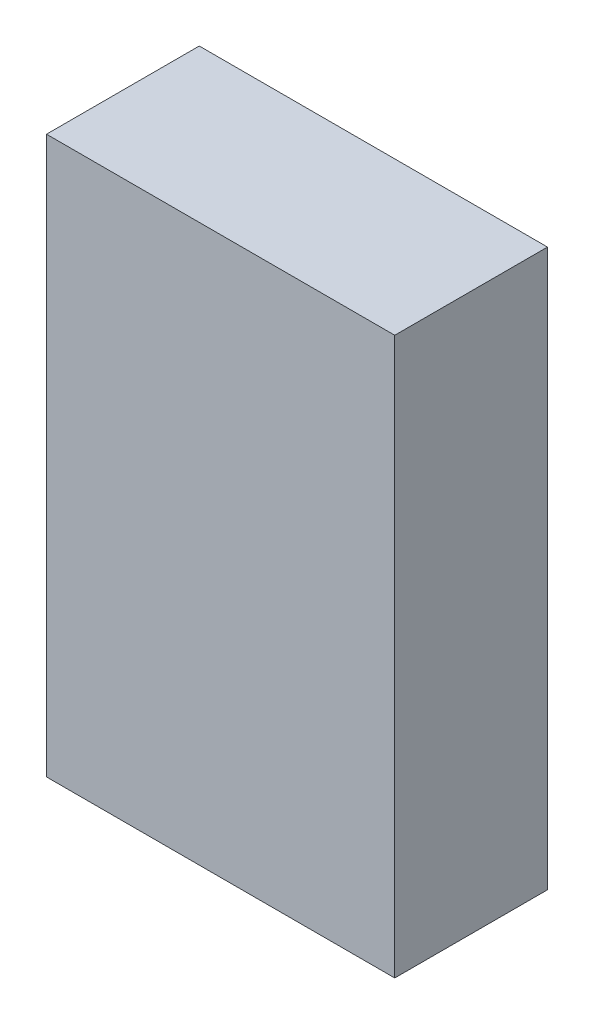
ISO-10303-21;
HEADER;
FILE_DESCRIPTION(('STEP AP214'),'2;1');
FILE_NAME('part.step','',(''),(''),'','','');
FILE_SCHEMA(('AUTOMOTIVE_DESIGN { 1 0 10303 214 1 1 1 1 }'));
ENDSEC;
DATA;
#1=APPLICATION_CONTEXT('core data for automotive mechanical design processes');
#2=APPLICATION_PROTOCOL_DEFINITION('international standard','automotive_design',2000,#1);
#3=PRODUCT_CONTEXT('',#1,'mechanical');
#4=PRODUCT('Part','Part','',(#3));
#5=PRODUCT_RELATED_PRODUCT_CATEGORY('part','',(#4));
#6=PRODUCT_DEFINITION_FORMATION('','',#4);
#7=PRODUCT_DEFINITION_CONTEXT('part definition',#1,'design');
#8=PRODUCT_DEFINITION('design','',#6,#7);
#9=PRODUCT_DEFINITION_SHAPE('','',#8);
#10=(LENGTH_UNIT() NAMED_UNIT(*) SI_UNIT(.MILLI.,.METRE.));
#11=(NAMED_UNIT(*) PLANE_ANGLE_UNIT() SI_UNIT($,.RADIAN.));
#12=(NAMED_UNIT(*) SI_UNIT($,.STERADIAN.) SOLID_ANGLE_UNIT());
#13=UNCERTAINTY_MEASURE_WITH_UNIT(LENGTH_MEASURE(1.E-05),#10,'distance_accuracy_value','');
#14=(GEOMETRIC_REPRESENTATION_CONTEXT(3) GLOBAL_UNCERTAINTY_ASSIGNED_CONTEXT((#13)) GLOBAL_UNIT_ASSIGNED_CONTEXT((#10,
#11,#12)) REPRESENTATION_CONTEXT('',''));
#15=CARTESIAN_POINT('',(0.,0.,0.));
#16=DIRECTION('',(0.,0.,1.));
#17=DIRECTION('',(1.,0.,0.));
#18=AXIS2_PLACEMENT_3D('',#15,#16,#17);
#19=CARTESIAN_POINT('',(0.,0.,2.));
#20=DIRECTION('',(0.,0.,-1.));
#21=DIRECTION('',(-1.,0.,0.));
#22=AXIS2_PLACEMENT_3D('',#19,#20,#21);
#23=PLANE('',#22);
#24=DIRECTION('',(1.,0.,0.));
#25=VECTOR('',#24,1.);
#26=CARTESIAN_POINT('',(-25.2899999999998,-22.38,2.));
#27=LINE('',#26,#25);
#28=CARTESIAN_POINT('',(-25.2899999999998,-22.38,2.));
#29=VERTEX_POINT('',#28);
#30=CARTESIAN_POINT('',(66.129932689862,-22.38,2.));
#31=VERTEX_POINT('',#30);
#32=EDGE_CURVE('E249',#29,#31,#27,.T.);
#33=ORIENTED_EDGE('',*,*,#32,.T.);
#34=DIRECTION('',(0.,1.,0.));
#35=VECTOR('',#34,1.);
#36=CARTESIAN_POINT('',(66.129932689862,-22.38,2.));
#37=LINE('',#36,#35);
#38=CARTESIAN_POINT('',(66.129932689862,123.75,2.));
#39=VERTEX_POINT('',#38);
#40=EDGE_CURVE('E246',#31,#39,#37,.T.);
#41=ORIENTED_EDGE('',*,*,#40,.T.);
#42=DIRECTION('',(-1.,0.,0.));
#43=VECTOR('',#42,1.);
#44=CARTESIAN_POINT('',(66.129932689862,123.75,2.));
#45=LINE('',#44,#43);
#46=CARTESIAN_POINT('',(-25.2899999999998,123.75,2.));
#47=VERTEX_POINT('',#46);
#48=EDGE_CURVE('E243',#39,#47,#45,.T.);
#49=ORIENTED_EDGE('',*,*,#48,.T.);
#50=DIRECTION('',(0.,-1.,0.));
#51=VECTOR('',#50,1.);
#52=CARTESIAN_POINT('',(-25.2899999999998,123.75,2.));
#53=LINE('',#52,#51);
#54=EDGE_CURVE('E239',#47,#29,#53,.T.);
#55=ORIENTED_EDGE('',*,*,#54,.T.);
#56=EDGE_LOOP('',(#33,#41,#49,#55));
#57=FACE_BOUND('',#56,.T.);
#58=ADVANCED_FACE('F35',(#57),#23,.F.);
#59=CARTESIAN_POINT('',(-25.2899999999998,-22.38,-210.470475989999));
#60=DIRECTION('',(0.,-1.,0.));
#61=DIRECTION('',(0.,0.,-1.));
#62=AXIS2_PLACEMENT_3D('',#59,#60,#61);
#63=PLANE('',#62);
#64=CARTESIAN_POINT('',(32.78,-22.38,-19.755));
#65=DIRECTION('',(0.,-1.,0.));
#66=DIRECTION('',(0.,0.,-1.));
#67=AXIS2_PLACEMENT_3D('',#64,#65,#66);
#68=CIRCLE('',#67,2.5);
#69=CARTESIAN_POINT('',(31.8966666666667,-22.38,-22.0937437273507));
#70=VERTEX_POINT('',#69);
#71=CARTESIAN_POINT('',(31.8966666666667,-22.38,-17.4162562726493));
#72=VERTEX_POINT('',#71);
#73=EDGE_CURVE('E50',#70,#72,#68,.T.);
#74=ORIENTED_EDGE('',*,*,#73,.F.);
#75=CARTESIAN_POINT('',(26.48,-22.38,-19.755));
#76=DIRECTION('',(0.,-1.,0.));
#77=DIRECTION('',(0.,0.,-1.));
#78=AXIS2_PLACEMENT_3D('',#75,#76,#77);
#79=CIRCLE('',#78,5.9);
#80=EDGE_CURVE('E167',#72,#70,#79,.T.);
#81=ORIENTED_EDGE('',*,*,#80,.F.);
#82=EDGE_LOOP('',(#74,#81));
#83=FACE_BOUND('',#82,.T.);
#84=DIRECTION('',(0.,0.,-1.));
#85=VECTOR('',#84,1.);
#86=CARTESIAN_POINT('',(-15.95,-22.38,0.));
#87=LINE('',#86,#85);
#88=CARTESIAN_POINT('',(-15.95,-22.38,0.));
#89=VERTEX_POINT('',#88);
#90=CARTESIAN_POINT('',(-15.95,-22.38,-4.));
#91=VERTEX_POINT('',#90);
#92=EDGE_CURVE('E58',#89,#91,#87,.T.);
#93=ORIENTED_EDGE('',*,*,#92,.F.);
#94=DIRECTION('',(-1.,0.,0.));
#95=VECTOR('',#94,1.);
#96=CARTESIAN_POINT('',(1.95,-22.38,0.));
#97=LINE('',#96,#95);
#98=CARTESIAN_POINT('',(1.95,-22.38,0.));
#99=VERTEX_POINT('',#98);
#100=EDGE_CURVE('E199',#99,#89,#97,.T.);
#101=ORIENTED_EDGE('',*,*,#100,.F.);
#102=DIRECTION('',(0.,0.,1.));
#103=VECTOR('',#102,1.);
#104=CARTESIAN_POINT('',(1.95,-22.38,-4.));
#105=LINE('',#104,#103);
#106=CARTESIAN_POINT('',(1.95,-22.38,-4.));
#107=VERTEX_POINT('',#106);
#108=EDGE_CURVE('E196',#107,#99,#105,.T.);
#109=ORIENTED_EDGE('',*,*,#108,.F.);
#110=DIRECTION('',(1.,0.,0.));
#111=VECTOR('',#110,1.);
#112=CARTESIAN_POINT('',(-15.95,-22.38,-4.));
#113=LINE('',#112,#111);
#114=EDGE_CURVE('E193',#91,#107,#113,.T.);
#115=ORIENTED_EDGE('',*,*,#114,.F.);
#116=EDGE_LOOP('',(#93,#101,#109,#115));
#117=FACE_BOUND('',#116,.T.);
#118=DIRECTION('',(0.,0.,1.));
#119=VECTOR('',#118,1.);
#120=CARTESIAN_POINT('',(13.73,-22.38,-23.91));
#121=LINE('',#120,#119);
#122=CARTESIAN_POINT('',(13.73,-22.38,-23.91));
#123=VERTEX_POINT('',#122);
#124=CARTESIAN_POINT('',(13.73,-22.38,-15.6));
#125=VERTEX_POINT('',#124);
#126=EDGE_CURVE('E217',#123,#125,#121,.T.);
#127=ORIENTED_EDGE('',*,*,#126,.F.);
#128=DIRECTION('',(1.,0.,0.));
#129=VECTOR('',#128,1.);
#130=CARTESIAN_POINT('',(-13.73,-22.38,-23.91));
#131=LINE('',#130,#129);
#132=CARTESIAN_POINT('',(-13.73,-22.38,-23.91));
#133=VERTEX_POINT('',#132);
#134=EDGE_CURVE('E225',#133,#123,#131,.T.);
#135=ORIENTED_EDGE('',*,*,#134,.F.);
#136=DIRECTION('',(0.,0.,-1.));
#137=VECTOR('',#136,1.);
#138=CARTESIAN_POINT('',(-13.73,-22.38,-15.6));
#139=LINE('',#138,#137);
#140=CARTESIAN_POINT('',(-13.73,-22.38,-15.6));
#141=VERTEX_POINT('',#140);
#142=EDGE_CURVE('E222',#141,#133,#139,.T.);
#143=ORIENTED_EDGE('',*,*,#142,.F.);
#144=DIRECTION('',(-1.,0.,0.));
#145=VECTOR('',#144,1.);
#146=CARTESIAN_POINT('',(13.73,-22.38,-15.6));
#147=LINE('',#146,#145);
#148=EDGE_CURVE('E219',#125,#141,#147,.T.);
#149=ORIENTED_EDGE('',*,*,#148,.F.);
#150=EDGE_LOOP('',(#127,#135,#143,#149));
#151=FACE_BOUND('',#150,.T.);
#152=DIRECTION('',(0.,0.,1.));
#153=VECTOR('',#152,1.);
#154=CARTESIAN_POINT('',(-25.2899999999998,-22.38,-210.470475989999));
#155=LINE('',#154,#153);
#156=CARTESIAN_POINT('',(-25.2899999999998,-22.38,-38.1));
#157=VERTEX_POINT('',#156);
#158=EDGE_CURVE('E274',#157,#29,#155,.T.);
#159=ORIENTED_EDGE('',*,*,#158,.F.);
#160=DIRECTION('',(1.,0.,0.));
#161=VECTOR('',#160,1.);
#162=CARTESIAN_POINT('',(-25.2899999999998,-22.38,-38.1));
#163=LINE('',#162,#161);
#164=CARTESIAN_POINT('',(66.129932689862,-22.38,-38.1));
#165=VERTEX_POINT('',#164);
#166=EDGE_CURVE('E173',#157,#165,#163,.T.);
#167=ORIENTED_EDGE('',*,*,#166,.T.);
#168=DIRECTION('',(0.,0.,1.));
#169=VECTOR('',#168,1.);
#170=CARTESIAN_POINT('',(66.129932689862,-22.38,-210.470475989999));
#171=LINE('',#170,#169);
#172=EDGE_CURVE('E270',#165,#31,#171,.T.);
#173=ORIENTED_EDGE('',*,*,#172,.T.);
#174=ORIENTED_EDGE('',*,*,#32,.F.);
#175=EDGE_LOOP('',(#159,#167,#173,#174));
#176=FACE_BOUND('',#175,.T.);
#177=ADVANCED_FACE('F328',(#83,#117,#151,#176),#63,.T.);
#178=CARTESIAN_POINT('',(-25.2899999999998,123.75,-210.470475989999));
#179=DIRECTION('',(-1.,0.,0.));
#180=DIRECTION('',(0.,0.,1.));
#181=AXIS2_PLACEMENT_3D('',#178,#179,#180);
#182=PLANE('',#181);
#183=DIRECTION('',(0.,0.,1.));
#184=VECTOR('',#183,1.);
#185=CARTESIAN_POINT('',(-25.2899999999998,123.75,-210.470475989999));
#186=LINE('',#185,#184);
#187=CARTESIAN_POINT('',(-25.2899999999998,123.75,-38.1));
#188=VERTEX_POINT('',#187);
#189=EDGE_CURVE('E257',#188,#47,#186,.T.);
#190=ORIENTED_EDGE('',*,*,#189,.F.);
#191=DIRECTION('',(0.,-1.,0.));
#192=VECTOR('',#191,1.);
#193=CARTESIAN_POINT('',(-25.2899999999998,123.75,-38.1));
#194=LINE('',#193,#192);
#195=EDGE_CURVE('E271',#188,#157,#194,.T.);
#196=ORIENTED_EDGE('',*,*,#195,.T.);
#197=ORIENTED_EDGE('',*,*,#158,.T.);
#198=ORIENTED_EDGE('',*,*,#54,.F.);
#199=EDGE_LOOP('',(#190,#196,#197,#198));
#200=FACE_BOUND('',#199,.T.);
#201=ADVANCED_FACE('F333',(#200),#182,.T.);
#202=CARTESIAN_POINT('',(66.129932689862,123.75,-210.470475989999));
#203=DIRECTION('',(0.,1.,0.));
#204=DIRECTION('',(0.,0.,1.));
#205=AXIS2_PLACEMENT_3D('',#202,#203,#204);
#206=PLANE('',#205);
#207=DIRECTION('',(0.,0.,1.));
#208=VECTOR('',#207,1.);
#209=CARTESIAN_POINT('',(66.129932689862,123.75,-210.470475989999));
#210=LINE('',#209,#208);
#211=CARTESIAN_POINT('',(66.129932689862,123.75,-38.1000000000001));
#212=VERTEX_POINT('',#211);
#213=EDGE_CURVE('E256',#212,#39,#210,.T.);
#214=ORIENTED_EDGE('',*,*,#213,.F.);
#215=DIRECTION('',(-1.,0.,0.));
#216=VECTOR('',#215,1.);
#217=CARTESIAN_POINT('',(66.129932689862,123.75,-38.1));
#218=LINE('',#217,#216);
#219=EDGE_CURVE('E275',#212,#188,#218,.T.);
#220=ORIENTED_EDGE('',*,*,#219,.T.);
#221=ORIENTED_EDGE('',*,*,#189,.T.);
#222=ORIENTED_EDGE('',*,*,#48,.F.);
#223=EDGE_LOOP('',(#214,#220,#221,#222));
#224=FACE_BOUND('',#223,.T.);
#225=ADVANCED_FACE('F345',(#224),#206,.T.);
#226=CARTESIAN_POINT('',(66.129932689862,-22.38,-210.470475989999));
#227=DIRECTION('',(1.,0.,0.));
#228=DIRECTION('',(0.,0.,-1.));
#229=AXIS2_PLACEMENT_3D('',#226,#227,#228);
#230=PLANE('',#229);
#231=ORIENTED_EDGE('',*,*,#172,.F.);
#232=DIRECTION('',(0.,1.,0.));
#233=VECTOR('',#232,1.);
#234=CARTESIAN_POINT('',(66.129932689862,-22.38,-38.1));
#235=LINE('',#234,#233);
#236=EDGE_CURVE('E253',#165,#212,#235,.T.);
#237=ORIENTED_EDGE('',*,*,#236,.T.);
#238=ORIENTED_EDGE('',*,*,#213,.T.);
#239=ORIENTED_EDGE('',*,*,#40,.F.);
#240=EDGE_LOOP('',(#231,#237,#238,#239));
#241=FACE_BOUND('',#240,.T.);
#242=ADVANCED_FACE('F341',(#241),#230,.T.);
#243=CARTESIAN_POINT('',(-23.2899999999998,-20.38,-210.470475989999));
#244=DIRECTION('',(0.,-1.,0.));
#245=DIRECTION('',(1.,0.,0.));
#246=AXIS2_PLACEMENT_3D('',#243,#244,#245);
#247=PLANE('',#246);
#248=CARTESIAN_POINT('',(26.48,-20.38,-19.755));
#249=DIRECTION('',(0.,-1.,0.));
#250=DIRECTION('',(1.,0.,0.));
#251=AXIS2_PLACEMENT_3D('',#248,#249,#250);
#252=CIRCLE('',#251,5.9);
#253=CARTESIAN_POINT('',(31.8966666666667,-20.38,-22.0937437273507));
#254=VERTEX_POINT('',#253);
#255=CARTESIAN_POINT('',(31.8966666666667,-20.38,-17.4162562726493));
#256=VERTEX_POINT('',#255);
#257=EDGE_CURVE('E170',#254,#256,#252,.F.);
#258=ORIENTED_EDGE('',*,*,#257,.F.);
#259=CARTESIAN_POINT('',(32.78,-20.38,-19.755));
#260=DIRECTION('',(0.,-1.,0.));
#261=DIRECTION('',(1.,0.,0.));
#262=AXIS2_PLACEMENT_3D('',#259,#260,#261);
#263=CIRCLE('',#262,2.5);
#264=EDGE_CURVE('E161',#256,#254,#263,.F.);
#265=ORIENTED_EDGE('',*,*,#264,.F.);
#266=EDGE_LOOP('',(#258,#265));
#267=FACE_BOUND('',#266,.T.);
#268=DIRECTION('',(1.,0.,0.));
#269=VECTOR('',#268,1.);
#270=CARTESIAN_POINT('',(64.129932689862,-20.38,0.));
#271=LINE('',#270,#269);
#272=CARTESIAN_POINT('',(-23.2899999999998,-20.38,0.));
#273=VERTEX_POINT('',#272);
#274=CARTESIAN_POINT('',(-15.95,-20.38,0.));
#275=VERTEX_POINT('',#274);
#276=EDGE_CURVE('E11',#273,#275,#271,.T.);
#277=ORIENTED_EDGE('',*,*,#276,.T.);
#278=DIRECTION('',(0.,0.,1.));
#279=VECTOR('',#278,1.);
#280=CARTESIAN_POINT('',(-15.95,-20.38,0.));
#281=LINE('',#280,#279);
#282=CARTESIAN_POINT('',(-15.95,-20.38,-4.));
#283=VERTEX_POINT('',#282);
#284=EDGE_CURVE('E189',#283,#275,#281,.T.);
#285=ORIENTED_EDGE('',*,*,#284,.F.);
#286=DIRECTION('',(-1.,0.,0.));
#287=VECTOR('',#286,1.);
#288=CARTESIAN_POINT('',(-15.95,-20.38,-4.));
#289=LINE('',#288,#287);
#290=CARTESIAN_POINT('',(1.95,-20.38,-4.));
#291=VERTEX_POINT('',#290);
#292=EDGE_CURVE('E177',#291,#283,#289,.T.);
#293=ORIENTED_EDGE('',*,*,#292,.F.);
#294=DIRECTION('',(0.,0.,-1.));
#295=VECTOR('',#294,1.);
#296=CARTESIAN_POINT('',(1.95,-20.38,-4.));
#297=LINE('',#296,#295);
#298=CARTESIAN_POINT('',(1.95,-20.38,0.));
#299=VERTEX_POINT('',#298);
#300=EDGE_CURVE('E186',#299,#291,#297,.T.);
#301=ORIENTED_EDGE('',*,*,#300,.F.);
#302=CARTESIAN_POINT('',(64.129932689862,-20.38,0.));
#303=VERTEX_POINT('',#302);
#304=EDGE_CURVE('E43',#299,#303,#271,.T.);
#305=ORIENTED_EDGE('',*,*,#304,.T.);
#306=DIRECTION('',(0.,0.,1.));
#307=VECTOR('',#306,1.);
#308=CARTESIAN_POINT('',(64.129932689862,-20.38,-210.470475989999));
#309=LINE('',#308,#307);
#310=CARTESIAN_POINT('',(64.129932689862,-20.38,-38.1000000000001));
#311=VERTEX_POINT('',#310);
#312=EDGE_CURVE('E252',#311,#303,#309,.T.);
#313=ORIENTED_EDGE('',*,*,#312,.F.);
#314=DIRECTION('',(1.,0.,0.));
#315=VECTOR('',#314,1.);
#316=CARTESIAN_POINT('',(-23.2899999999998,-20.38,-38.1));
#317=LINE('',#316,#315);
#318=CARTESIAN_POINT('',(-23.2899999999998,-20.38,-38.1000000000001));
#319=VERTEX_POINT('',#318);
#320=EDGE_CURVE('E258',#319,#311,#317,.T.);
#321=ORIENTED_EDGE('',*,*,#320,.F.);
#322=DIRECTION('',(0.,0.,1.));
#323=VECTOR('',#322,1.);
#324=CARTESIAN_POINT('',(-23.2899999999998,-20.38,-210.470475989999));
#325=LINE('',#324,#323);
#326=EDGE_CURVE('E283',#319,#273,#325,.T.);
#327=ORIENTED_EDGE('',*,*,#326,.T.);
#328=EDGE_LOOP('',(#277,#285,#293,#301,#305,#313,#321,#327));
#329=FACE_BOUND('',#328,.T.);
#330=DIRECTION('',(-1.,0.,0.));
#331=VECTOR('',#330,1.);
#332=CARTESIAN_POINT('',(-13.73,-20.38,-23.91));
#333=LINE('',#332,#331);
#334=CARTESIAN_POINT('',(13.73,-20.38,-23.91));
#335=VERTEX_POINT('',#334);
#336=CARTESIAN_POINT('',(-13.73,-20.38,-23.91));
#337=VERTEX_POINT('',#336);
#338=EDGE_CURVE('E211',#335,#337,#333,.T.);
#339=ORIENTED_EDGE('',*,*,#338,.F.);
#340=DIRECTION('',(0.,0.,-1.));
#341=VECTOR('',#340,1.);
#342=CARTESIAN_POINT('',(13.73,-20.38,-23.91));
#343=LINE('',#342,#341);
#344=CARTESIAN_POINT('',(13.73,-20.38,-15.6));
#345=VERTEX_POINT('',#344);
#346=EDGE_CURVE('E214',#345,#335,#343,.T.);
#347=ORIENTED_EDGE('',*,*,#346,.F.);
#348=DIRECTION('',(1.,0.,0.));
#349=VECTOR('',#348,1.);
#350=CARTESIAN_POINT('',(13.73,-20.38,-15.6));
#351=LINE('',#350,#349);
#352=CARTESIAN_POINT('',(-13.73,-20.38,-15.6));
#353=VERTEX_POINT('',#352);
#354=EDGE_CURVE('E190',#353,#345,#351,.T.);
#355=ORIENTED_EDGE('',*,*,#354,.F.);
#356=DIRECTION('',(0.,0.,1.));
#357=VECTOR('',#356,1.);
#358=CARTESIAN_POINT('',(-13.73,-20.38,-15.6));
#359=LINE('',#358,#357);
#360=EDGE_CURVE('E209',#337,#353,#359,.T.);
#361=ORIENTED_EDGE('',*,*,#360,.F.);
#362=EDGE_LOOP('',(#339,#347,#355,#361));
#363=FACE_BOUND('',#362,.T.);
#364=ADVANCED_FACE('F175',(#267,#329,#363),#247,.F.);
#365=CARTESIAN_POINT('',(-23.2899999999998,121.75,-210.470475989999));
#366=DIRECTION('',(-1.,0.,0.));
#367=DIRECTION('',(0.,-1.,0.));
#368=AXIS2_PLACEMENT_3D('',#365,#366,#367);
#369=PLANE('',#368);
#370=DIRECTION('',(0.,-1.,0.));
#371=VECTOR('',#370,1.);
#372=CARTESIAN_POINT('',(-23.2899999999998,121.75,0.));
#373=LINE('',#372,#371);
#374=CARTESIAN_POINT('',(-23.2899999999998,121.75,0.));
#375=VERTEX_POINT('',#374);
#376=EDGE_CURVE('E299',#375,#273,#373,.T.);
#377=ORIENTED_EDGE('',*,*,#376,.T.);
#378=ORIENTED_EDGE('',*,*,#326,.F.);
#379=DIRECTION('',(0.,-1.,0.));
#380=VECTOR('',#379,1.);
#381=CARTESIAN_POINT('',(-23.2899999999998,121.75,-38.1));
#382=LINE('',#381,#380);
#383=CARTESIAN_POINT('',(-23.2899999999998,121.75,-38.1000000000001));
#384=VERTEX_POINT('',#383);
#385=EDGE_CURVE('E242',#384,#319,#382,.T.);
#386=ORIENTED_EDGE('',*,*,#385,.F.);
#387=DIRECTION('',(0.,0.,1.));
#388=VECTOR('',#387,1.);
#389=CARTESIAN_POINT('',(-23.2899999999998,121.75,-210.470475989999));
#390=LINE('',#389,#388);
#391=EDGE_CURVE('E287',#384,#375,#390,.T.);
#392=ORIENTED_EDGE('',*,*,#391,.T.);
#393=EDGE_LOOP('',(#377,#378,#386,#392));
#394=FACE_BOUND('',#393,.T.);
#395=ADVANCED_FACE('F315',(#394),#369,.F.);
#396=CARTESIAN_POINT('',(64.129932689862,121.75,-210.470475989999));
#397=DIRECTION('',(0.,1.,0.));
#398=DIRECTION('',(-1.,0.,0.));
#399=AXIS2_PLACEMENT_3D('',#396,#397,#398);
#400=PLANE('',#399);
#401=DIRECTION('',(-1.,0.,0.));
#402=VECTOR('',#401,1.);
#403=CARTESIAN_POINT('',(64.129932689862,121.75,0.));
#404=LINE('',#403,#402);
#405=CARTESIAN_POINT('',(64.129932689862,121.75,0.));
#406=VERTEX_POINT('',#405);
#407=EDGE_CURVE('E297',#406,#375,#404,.T.);
#408=ORIENTED_EDGE('',*,*,#407,.T.);
#409=ORIENTED_EDGE('',*,*,#391,.F.);
#410=DIRECTION('',(-1.,0.,0.));
#411=VECTOR('',#410,1.);
#412=CARTESIAN_POINT('',(64.129932689862,121.75,-38.1));
#413=LINE('',#412,#411);
#414=CARTESIAN_POINT('',(64.129932689862,121.75,-38.1));
#415=VERTEX_POINT('',#414);
#416=EDGE_CURVE('E264',#415,#384,#413,.T.);
#417=ORIENTED_EDGE('',*,*,#416,.F.);
#418=DIRECTION('',(0.,0.,1.));
#419=VECTOR('',#418,1.);
#420=CARTESIAN_POINT('',(64.129932689862,121.75,-210.470475989999));
#421=LINE('',#420,#419);
#422=EDGE_CURVE('E290',#415,#406,#421,.T.);
#423=ORIENTED_EDGE('',*,*,#422,.T.);
#424=EDGE_LOOP('',(#408,#409,#417,#423));
#425=FACE_BOUND('',#424,.T.);
#426=ADVANCED_FACE('F318',(#425),#400,.F.);
#427=CARTESIAN_POINT('',(64.129932689862,-20.38,-210.470475989999));
#428=DIRECTION('',(1.,0.,0.));
#429=DIRECTION('',(0.,1.,0.));
#430=AXIS2_PLACEMENT_3D('',#427,#428,#429);
#431=PLANE('',#430);
#432=DIRECTION('',(0.,1.,0.));
#433=VECTOR('',#432,1.);
#434=CARTESIAN_POINT('',(64.129932689862,121.75,0.));
#435=LINE('',#434,#433);
#436=EDGE_CURVE('E267',#303,#406,#435,.T.);
#437=ORIENTED_EDGE('',*,*,#436,.T.);
#438=ORIENTED_EDGE('',*,*,#422,.F.);
#439=DIRECTION('',(0.,1.,0.));
#440=VECTOR('',#439,1.);
#441=CARTESIAN_POINT('',(64.129932689862,-20.38,-38.1));
#442=LINE('',#441,#440);
#443=EDGE_CURVE('E261',#311,#415,#442,.T.);
#444=ORIENTED_EDGE('',*,*,#443,.F.);
#445=ORIENTED_EDGE('',*,*,#312,.T.);
#446=EDGE_LOOP('',(#437,#438,#444,#445));
#447=FACE_BOUND('',#446,.T.);
#448=ADVANCED_FACE('F311',(#447),#431,.F.);
#449=CARTESIAN_POINT('',(0.,0.,-38.1));
#450=DIRECTION('',(0.,0.,-1.));
#451=DIRECTION('',(-1.,0.,0.));
#452=AXIS2_PLACEMENT_3D('',#449,#450,#451);
#453=PLANE('',#452);
#454=ORIENTED_EDGE('',*,*,#166,.F.);
#455=ORIENTED_EDGE('',*,*,#195,.F.);
#456=ORIENTED_EDGE('',*,*,#219,.F.);
#457=ORIENTED_EDGE('',*,*,#236,.F.);
#458=EDGE_LOOP('',(#454,#455,#456,#457));
#459=FACE_BOUND('',#458,.T.);
#460=ORIENTED_EDGE('',*,*,#385,.T.);
#461=ORIENTED_EDGE('',*,*,#320,.T.);
#462=ORIENTED_EDGE('',*,*,#443,.T.);
#463=ORIENTED_EDGE('',*,*,#416,.T.);
#464=EDGE_LOOP('',(#460,#461,#462,#463));
#465=FACE_BOUND('',#464,.T.);
#466=ADVANCED_FACE('F314',(#459,#465),#453,.T.);
#467=CARTESIAN_POINT('',(0.,0.,0.));
#468=DIRECTION('',(0.,0.,-1.));
#469=DIRECTION('',(-1.,0.,0.));
#470=AXIS2_PLACEMENT_3D('',#467,#468,#469);
#471=PLANE('',#470);
#472=ORIENTED_EDGE('',*,*,#436,.F.);
#473=ORIENTED_EDGE('',*,*,#304,.F.);
#474=DIRECTION('',(0.,-1.,0.));
#475=VECTOR('',#474,1.);
#476=CARTESIAN_POINT('',(1.95,123.751,0.));
#477=LINE('',#476,#475);
#478=EDGE_CURVE('E204',#299,#99,#477,.T.);
#479=ORIENTED_EDGE('',*,*,#478,.T.);
#480=ORIENTED_EDGE('',*,*,#100,.T.);
#481=DIRECTION('',(0.,-1.,0.));
#482=VECTOR('',#481,1.);
#483=CARTESIAN_POINT('',(-15.95,123.751,0.));
#484=LINE('',#483,#482);
#485=EDGE_CURVE('E181',#275,#89,#484,.T.);
#486=ORIENTED_EDGE('',*,*,#485,.F.);
#487=ORIENTED_EDGE('',*,*,#276,.F.);
#488=ORIENTED_EDGE('',*,*,#376,.F.);
#489=ORIENTED_EDGE('',*,*,#407,.F.);
#490=EDGE_LOOP('',(#472,#473,#479,#480,#486,#487,#488,#489));
#491=FACE_BOUND('',#490,.T.);
#492=ADVANCED_FACE('F37',(#491),#471,.T.);
#493=CARTESIAN_POINT('',(-15.95,123.751,0.));
#494=DIRECTION('',(-1.,0.,0.));
#495=DIRECTION('',(0.,0.,1.));
#496=AXIS2_PLACEMENT_3D('',#493,#494,#495);
#497=PLANE('',#496);
#498=ORIENTED_EDGE('',*,*,#284,.T.);
#499=ORIENTED_EDGE('',*,*,#485,.T.);
#500=ORIENTED_EDGE('',*,*,#92,.T.);
#501=DIRECTION('',(0.,-1.,0.));
#502=VECTOR('',#501,1.);
#503=CARTESIAN_POINT('',(-15.95,123.751,-4.));
#504=LINE('',#503,#502);
#505=EDGE_CURVE('E202',#283,#91,#504,.T.);
#506=ORIENTED_EDGE('',*,*,#505,.F.);
#507=EDGE_LOOP('',(#498,#499,#500,#506));
#508=FACE_BOUND('',#507,.T.);
#509=ADVANCED_FACE('F420',(#508),#497,.F.);
#510=CARTESIAN_POINT('',(1.95,123.751,-4.));
#511=DIRECTION('',(1.,0.,0.));
#512=DIRECTION('',(0.,0.,-1.));
#513=AXIS2_PLACEMENT_3D('',#510,#511,#512);
#514=PLANE('',#513);
#515=ORIENTED_EDGE('',*,*,#300,.T.);
#516=DIRECTION('',(0.,-1.,0.));
#517=VECTOR('',#516,1.);
#518=CARTESIAN_POINT('',(1.95,123.751,-4.));
#519=LINE('',#518,#517);
#520=EDGE_CURVE('E206',#291,#107,#519,.T.);
#521=ORIENTED_EDGE('',*,*,#520,.T.);
#522=ORIENTED_EDGE('',*,*,#108,.T.);
#523=ORIENTED_EDGE('',*,*,#478,.F.);
#524=EDGE_LOOP('',(#515,#521,#522,#523));
#525=FACE_BOUND('',#524,.T.);
#526=ADVANCED_FACE('F429',(#525),#514,.F.);
#527=CARTESIAN_POINT('',(-15.95,123.751,-4.));
#528=DIRECTION('',(0.,0.,-1.));
#529=DIRECTION('',(-1.,0.,0.));
#530=AXIS2_PLACEMENT_3D('',#527,#528,#529);
#531=PLANE('',#530);
#532=ORIENTED_EDGE('',*,*,#292,.T.);
#533=ORIENTED_EDGE('',*,*,#505,.T.);
#534=ORIENTED_EDGE('',*,*,#114,.T.);
#535=ORIENTED_EDGE('',*,*,#520,.F.);
#536=EDGE_LOOP('',(#532,#533,#534,#535));
#537=FACE_BOUND('',#536,.T.);
#538=ADVANCED_FACE('F438',(#537),#531,.F.);
#539=CARTESIAN_POINT('',(13.73,123.751,-23.91));
#540=DIRECTION('',(1.,0.,0.));
#541=DIRECTION('',(0.,0.,-1.));
#542=AXIS2_PLACEMENT_3D('',#539,#540,#541);
#543=PLANE('',#542);
#544=ORIENTED_EDGE('',*,*,#346,.T.);
#545=DIRECTION('',(0.,-1.,0.));
#546=VECTOR('',#545,1.);
#547=CARTESIAN_POINT('',(13.73,123.751,-23.91));
#548=LINE('',#547,#546);
#549=EDGE_CURVE('E229',#335,#123,#548,.T.);
#550=ORIENTED_EDGE('',*,*,#549,.T.);
#551=ORIENTED_EDGE('',*,*,#126,.T.);
#552=DIRECTION('',(0.,-1.,0.));
#553=VECTOR('',#552,1.);
#554=CARTESIAN_POINT('',(13.73,123.751,-15.6));
#555=LINE('',#554,#553);
#556=EDGE_CURVE('E228',#345,#125,#555,.T.);
#557=ORIENTED_EDGE('',*,*,#556,.F.);
#558=EDGE_LOOP('',(#544,#550,#551,#557));
#559=FACE_BOUND('',#558,.T.);
#560=ADVANCED_FACE('F355',(#559),#543,.F.);
#561=CARTESIAN_POINT('',(-13.73,123.751,-23.91));
#562=DIRECTION('',(0.,0.,-1.));
#563=DIRECTION('',(-1.,0.,0.));
#564=AXIS2_PLACEMENT_3D('',#561,#562,#563);
#565=PLANE('',#564);
#566=ORIENTED_EDGE('',*,*,#338,.T.);
#567=DIRECTION('',(0.,-1.,0.));
#568=VECTOR('',#567,1.);
#569=CARTESIAN_POINT('',(-13.73,123.751,-23.91));
#570=LINE('',#569,#568);
#571=EDGE_CURVE('E231',#337,#133,#570,.T.);
#572=ORIENTED_EDGE('',*,*,#571,.T.);
#573=ORIENTED_EDGE('',*,*,#134,.T.);
#574=ORIENTED_EDGE('',*,*,#549,.F.);
#575=EDGE_LOOP('',(#566,#572,#573,#574));
#576=FACE_BOUND('',#575,.T.);
#577=ADVANCED_FACE('F457',(#576),#565,.F.);
#578=CARTESIAN_POINT('',(-13.73,123.751,-15.6));
#579=DIRECTION('',(-1.,0.,0.));
#580=DIRECTION('',(0.,0.,1.));
#581=AXIS2_PLACEMENT_3D('',#578,#579,#580);
#582=PLANE('',#581);
#583=ORIENTED_EDGE('',*,*,#360,.T.);
#584=DIRECTION('',(0.,-1.,0.));
#585=VECTOR('',#584,1.);
#586=CARTESIAN_POINT('',(-13.73,123.751,-15.6));
#587=LINE('',#586,#585);
#588=EDGE_CURVE('E233',#353,#141,#587,.T.);
#589=ORIENTED_EDGE('',*,*,#588,.T.);
#590=ORIENTED_EDGE('',*,*,#142,.T.);
#591=ORIENTED_EDGE('',*,*,#571,.F.);
#592=EDGE_LOOP('',(#583,#589,#590,#591));
#593=FACE_BOUND('',#592,.T.);
#594=ADVANCED_FACE('F466',(#593),#582,.F.);
#595=CARTESIAN_POINT('',(13.73,123.751,-15.6));
#596=DIRECTION('',(0.,0.,1.));
#597=DIRECTION('',(1.,0.,0.));
#598=AXIS2_PLACEMENT_3D('',#595,#596,#597);
#599=PLANE('',#598);
#600=ORIENTED_EDGE('',*,*,#354,.T.);
#601=ORIENTED_EDGE('',*,*,#556,.T.);
#602=ORIENTED_EDGE('',*,*,#148,.T.);
#603=ORIENTED_EDGE('',*,*,#588,.F.);
#604=EDGE_LOOP('',(#600,#601,#602,#603));
#605=FACE_BOUND('',#604,.T.);
#606=ADVANCED_FACE('F476',(#605),#599,.F.);
#607=CARTESIAN_POINT('',(32.78,123.751,-19.755));
#608=DIRECTION('',(0.,-1.,0.));
#609=DIRECTION('',(0.,0.,-1.));
#610=AXIS2_PLACEMENT_3D('',#607,#608,#609);
#611=CYLINDRICAL_SURFACE('',#610,2.5);
#612=ORIENTED_EDGE('',*,*,#264,.T.);
#613=DIRECTION('',(0.,-1.,0.));
#614=VECTOR('',#613,1.);
#615=CARTESIAN_POINT('',(31.8966666666667,123.751,-22.0937437273507));
#616=LINE('',#615,#614);
#617=EDGE_CURVE('E166',#254,#70,#616,.T.);
#618=ORIENTED_EDGE('',*,*,#617,.T.);
#619=ORIENTED_EDGE('',*,*,#73,.T.);
#620=DIRECTION('',(0.,-1.,0.));
#621=VECTOR('',#620,1.);
#622=CARTESIAN_POINT('',(31.8966666666667,123.751,-17.4162562726493));
#623=LINE('',#622,#621);
#624=EDGE_CURVE('E157',#256,#72,#623,.T.);
#625=ORIENTED_EDGE('',*,*,#624,.F.);
#626=EDGE_LOOP('',(#612,#618,#619,#625));
#627=FACE_BOUND('',#626,.T.);
#628=ADVANCED_FACE('F159',(#627),#611,.F.);
#629=CARTESIAN_POINT('',(26.48,123.751,-19.755));
#630=DIRECTION('',(0.,-1.,0.));
#631=DIRECTION('',(0.,0.,-1.));
#632=AXIS2_PLACEMENT_3D('',#629,#630,#631);
#633=CYLINDRICAL_SURFACE('',#632,5.9);
#634=ORIENTED_EDGE('',*,*,#257,.T.);
#635=ORIENTED_EDGE('',*,*,#624,.T.);
#636=ORIENTED_EDGE('',*,*,#80,.T.);
#637=ORIENTED_EDGE('',*,*,#617,.F.);
#638=EDGE_LOOP('',(#634,#635,#636,#637));
#639=FACE_BOUND('',#638,.T.);
#640=ADVANCED_FACE('F171',(#639),#633,.F.);
#641=CLOSED_SHELL('',(#58,#177,#201,#225,#242,#364,#395,#426,#448,#466,#492,#509,#526,#538,#560,
#577,#594,#606,#628,#640));
#642=MANIFOLD_SOLID_BREP('B2',#641);
#643=ADVANCED_BREP_SHAPE_REPRESENTATION('',(#18,#642),#14);
#644=SHAPE_DEFINITION_REPRESENTATION(#9,#643);
ENDSEC;
END-ISO-10303-21;
